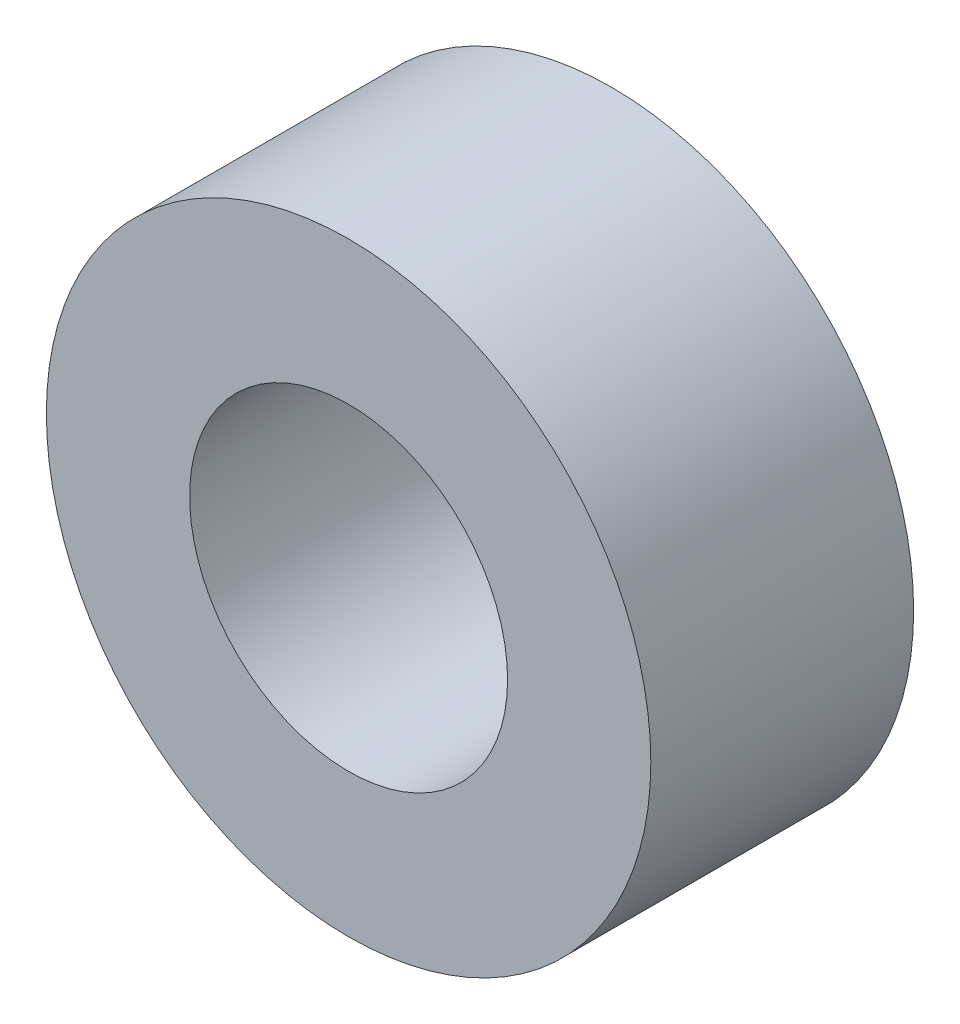
ISO-10303-21;
HEADER;
FILE_DESCRIPTION(('STEP AP214'),'2;1');
FILE_NAME('part.step','',(''),(''),'','','');
FILE_SCHEMA(('AUTOMOTIVE_DESIGN { 1 0 10303 214 1 1 1 1 }'));
ENDSEC;
DATA;
#1=APPLICATION_CONTEXT('core data for automotive mechanical design processes');
#2=APPLICATION_PROTOCOL_DEFINITION('international standard','automotive_design',2000,#1);
#3=PRODUCT_CONTEXT('',#1,'mechanical');
#4=PRODUCT('Part','Part','',(#3));
#5=PRODUCT_RELATED_PRODUCT_CATEGORY('part','',(#4));
#6=PRODUCT_DEFINITION_FORMATION('','',#4);
#7=PRODUCT_DEFINITION_CONTEXT('part definition',#1,'design');
#8=PRODUCT_DEFINITION('design','',#6,#7);
#9=PRODUCT_DEFINITION_SHAPE('','',#8);
#10=(LENGTH_UNIT() NAMED_UNIT(*) SI_UNIT(.MILLI.,.METRE.));
#11=(NAMED_UNIT(*) PLANE_ANGLE_UNIT() SI_UNIT($,.RADIAN.));
#12=(NAMED_UNIT(*) SI_UNIT($,.STERADIAN.) SOLID_ANGLE_UNIT());
#13=UNCERTAINTY_MEASURE_WITH_UNIT(LENGTH_MEASURE(1.E-05),#10,'distance_accuracy_value','');
#14=(GEOMETRIC_REPRESENTATION_CONTEXT(3) GLOBAL_UNCERTAINTY_ASSIGNED_CONTEXT((#13)) GLOBAL_UNIT_ASSIGNED_CONTEXT((#10,
#11,#12)) REPRESENTATION_CONTEXT('',''));
#15=CARTESIAN_POINT('',(0.,0.,0.));
#16=DIRECTION('',(0.,0.,1.));
#17=DIRECTION('',(1.,0.,0.));
#18=AXIS2_PLACEMENT_3D('',#15,#16,#17);
#19=CARTESIAN_POINT('',(0.,0.,5.));
#20=DIRECTION('',(0.,0.,-1.));
#21=DIRECTION('',(-1.,0.,0.));
#22=AXIS2_PLACEMENT_3D('',#19,#20,#21);
#23=CYLINDRICAL_SURFACE('',#22,5.75);
#24=CARTESIAN_POINT('',(0.,0.,5.));
#25=DIRECTION('',(0.,0.,1.));
#26=DIRECTION('',(1.,0.,0.));
#27=AXIS2_PLACEMENT_3D('',#24,#25,#26);
#28=CIRCLE('',#27,5.75);
#29=CARTESIAN_POINT('',(5.75,0.,5.));
#30=VERTEX_POINT('',#29);
#31=EDGE_CURVE('E10',#30,#30,#28,.T.);
#32=ORIENTED_EDGE('',*,*,#31,.F.);
#33=EDGE_LOOP('',(#32));
#34=FACE_BOUND('',#33,.T.);
#35=CARTESIAN_POINT('',(0.,0.,0.));
#36=DIRECTION('',(0.,0.,1.));
#37=DIRECTION('',(1.,0.,0.));
#38=AXIS2_PLACEMENT_3D('',#35,#36,#37);
#39=CIRCLE('',#38,5.75);
#40=CARTESIAN_POINT('',(5.75,0.,0.));
#41=VERTEX_POINT('',#40);
#42=EDGE_CURVE('E44',#41,#41,#39,.T.);
#43=ORIENTED_EDGE('',*,*,#42,.T.);
#44=EDGE_LOOP('',(#43));
#45=FACE_BOUND('',#44,.T.);
#46=ADVANCED_FACE('F41',(#34,#45),#23,.T.);
#47=CARTESIAN_POINT('',(0.,0.,5.));
#48=DIRECTION('',(0.,0.,1.));
#49=DIRECTION('',(1.,0.,0.));
#50=AXIS2_PLACEMENT_3D('',#47,#48,#49);
#51=PLANE('',#50);
#52=CARTESIAN_POINT('',(0.,0.,5.));
#53=DIRECTION('',(0.,0.,1.));
#54=DIRECTION('',(1.,0.,0.));
#55=AXIS2_PLACEMENT_3D('',#52,#53,#54);
#56=CIRCLE('',#55,3.025);
#57=CARTESIAN_POINT('',(3.025,0.,5.));
#58=VERTEX_POINT('',#57);
#59=EDGE_CURVE('E53',#58,#58,#56,.T.);
#60=ORIENTED_EDGE('',*,*,#59,.F.);
#61=EDGE_LOOP('',(#60));
#62=FACE_BOUND('',#61,.T.);
#63=ORIENTED_EDGE('',*,*,#31,.T.);
#64=EDGE_LOOP('',(#63));
#65=FACE_BOUND('',#64,.T.);
#66=ADVANCED_FACE('F68',(#62,#65),#51,.T.);
#67=CARTESIAN_POINT('',(0.,0.,0.));
#68=DIRECTION('',(0.,0.,1.));
#69=DIRECTION('',(1.,0.,0.));
#70=AXIS2_PLACEMENT_3D('',#67,#68,#69);
#71=PLANE('',#70);
#72=ORIENTED_EDGE('',*,*,#42,.F.);
#73=EDGE_LOOP('',(#72));
#74=FACE_BOUND('',#73,.T.);
#75=ADVANCED_FACE('F64',(#74),#71,.F.);
#76=CARTESIAN_POINT('',(0.,0.,0.200000000000001));
#77=DIRECTION('',(0.,0.,1.));
#78=DIRECTION('',(1.,0.,0.));
#79=AXIS2_PLACEMENT_3D('',#76,#77,#78);
#80=CYLINDRICAL_SURFACE('',#79,3.025);
#81=CARTESIAN_POINT('',(0.,0.,0.200000000000001));
#82=DIRECTION('',(0.,0.,1.));
#83=DIRECTION('',(1.,0.,0.));
#84=AXIS2_PLACEMENT_3D('',#81,#82,#83);
#85=CIRCLE('',#84,3.025);
#86=CARTESIAN_POINT('',(3.025,0.,0.200000000000001));
#87=VERTEX_POINT('',#86);
#88=EDGE_CURVE('E51',#87,#87,#85,.T.);
#89=ORIENTED_EDGE('',*,*,#88,.F.);
#90=EDGE_LOOP('',(#89));
#91=FACE_BOUND('',#90,.T.);
#92=ORIENTED_EDGE('',*,*,#59,.T.);
#93=EDGE_LOOP('',(#92));
#94=FACE_BOUND('',#93,.T.);
#95=ADVANCED_FACE('F61',(#91,#94),#80,.F.);
#96=CARTESIAN_POINT('',(0.,0.,0.200000000000001));
#97=DIRECTION('',(0.,0.,1.));
#98=DIRECTION('',(1.,0.,0.));
#99=AXIS2_PLACEMENT_3D('',#96,#97,#98);
#100=PLANE('',#99);
#101=ORIENTED_EDGE('',*,*,#88,.T.);
#102=EDGE_LOOP('',(#101));
#103=FACE_BOUND('',#102,.T.);
#104=ADVANCED_FACE('F59',(#103),#100,.T.);
#105=CLOSED_SHELL('',(#46,#66,#75,#95,#104));
#106=MANIFOLD_SOLID_BREP('B2',#105);
#107=ADVANCED_BREP_SHAPE_REPRESENTATION('',(#18,#106),#14);
#108=SHAPE_DEFINITION_REPRESENTATION(#9,#107);
ENDSEC;
END-ISO-10303-21;
